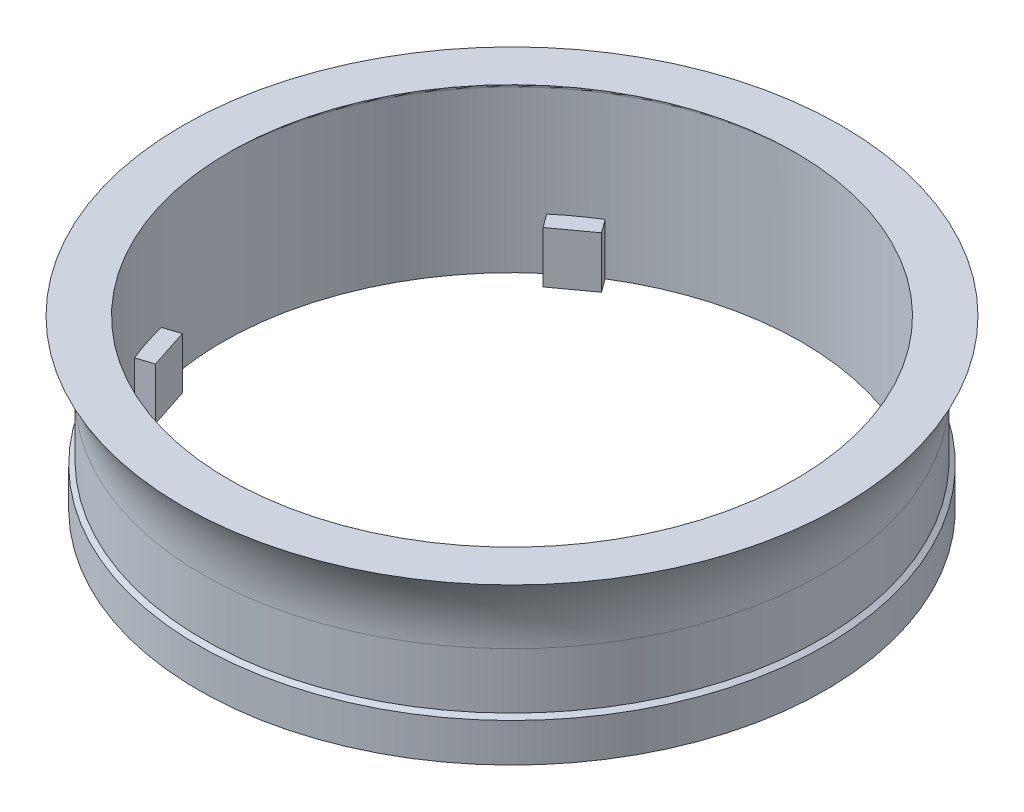
ISO-10303-21;
HEADER;
FILE_DESCRIPTION(('STEP AP214'),'2;1');
FILE_NAME('part.step','',(''),(''),'','','');
FILE_SCHEMA(('AUTOMOTIVE_DESIGN { 1 0 10303 214 1 1 1 1 }'));
ENDSEC;
DATA;
#1=APPLICATION_CONTEXT('core data for automotive mechanical design processes');
#2=APPLICATION_PROTOCOL_DEFINITION('international standard','automotive_design',2000,#1);
#3=PRODUCT_CONTEXT('',#1,'mechanical');
#4=PRODUCT('Part','Part','',(#3));
#5=PRODUCT_RELATED_PRODUCT_CATEGORY('part','',(#4));
#6=PRODUCT_DEFINITION_FORMATION('','',#4);
#7=PRODUCT_DEFINITION_CONTEXT('part definition',#1,'design');
#8=PRODUCT_DEFINITION('design','',#6,#7);
#9=PRODUCT_DEFINITION_SHAPE('','',#8);
#10=(LENGTH_UNIT() NAMED_UNIT(*) SI_UNIT(.MILLI.,.METRE.));
#11=(NAMED_UNIT(*) PLANE_ANGLE_UNIT() SI_UNIT($,.RADIAN.));
#12=(NAMED_UNIT(*) SI_UNIT($,.STERADIAN.) SOLID_ANGLE_UNIT());
#13=UNCERTAINTY_MEASURE_WITH_UNIT(LENGTH_MEASURE(1.E-05),#10,'distance_accuracy_value','');
#14=(GEOMETRIC_REPRESENTATION_CONTEXT(3) GLOBAL_UNCERTAINTY_ASSIGNED_CONTEXT((#13)) GLOBAL_UNIT_ASSIGNED_CONTEXT((#10,
#11,#12)) REPRESENTATION_CONTEXT('',''));
#15=CARTESIAN_POINT('',(0.,0.,0.));
#16=DIRECTION('',(0.,0.,1.));
#17=DIRECTION('',(1.,0.,0.));
#18=AXIS2_PLACEMENT_3D('',#15,#16,#17);
#19=CARTESIAN_POINT('',(0.,13.,0.));
#20=DIRECTION('',(0.,-1.,0.));
#21=DIRECTION('',(0.,0.,-1.));
#22=AXIS2_PLACEMENT_3D('',#19,#20,#21);
#23=PLANE('',#22);
#24=CARTESIAN_POINT('',(0.,13.,0.));
#25=DIRECTION('',(0.,1.,0.));
#26=DIRECTION('',(0.,0.,1.));
#27=AXIS2_PLACEMENT_3D('',#24,#25,#26);
#28=CIRCLE('',#27,25.5955328218123);
#29=CARTESIAN_POINT('',(0.,13.,25.5955328218123));
#30=VERTEX_POINT('',#29);
#31=EDGE_CURVE('E45',#30,#30,#28,.T.);
#32=ORIENTED_EDGE('',*,*,#31,.T.);
#33=EDGE_LOOP('',(#32));
#34=FACE_BOUND('',#33,.T.);
#35=CARTESIAN_POINT('',(0.,13.,0.));
#36=DIRECTION('',(0.,-1.,0.));
#37=DIRECTION('',(0.,0.,-1.));
#38=AXIS2_PLACEMENT_3D('',#35,#36,#37);
#39=CIRCLE('',#38,22.);
#40=CARTESIAN_POINT('',(0.,13.,-22.));
#41=VERTEX_POINT('',#40);
#42=EDGE_CURVE('E218',#41,#41,#39,.T.);
#43=ORIENTED_EDGE('',*,*,#42,.T.);
#44=EDGE_LOOP('',(#43));
#45=FACE_BOUND('',#44,.T.);
#46=ADVANCED_FACE('F42',(#34,#45),#23,.F.);
#47=CARTESIAN_POINT('',(0.,0.,0.));
#48=DIRECTION('',(0.,-1.,0.));
#49=DIRECTION('',(0.,0.,-1.));
#50=AXIS2_PLACEMENT_3D('',#47,#48,#49);
#51=CYLINDRICAL_SURFACE('',#50,24.35);
#52=CARTESIAN_POINT('',(0.,3.,0.));
#53=DIRECTION('',(0.,-1.,0.));
#54=DIRECTION('',(0.,0.,-1.));
#55=AXIS2_PLACEMENT_3D('',#52,#53,#54);
#56=CIRCLE('',#55,24.35);
#57=CARTESIAN_POINT('',(0.,3.,-24.35));
#58=VERTEX_POINT('',#57);
#59=EDGE_CURVE('E244',#58,#58,#56,.T.);
#60=ORIENTED_EDGE('',*,*,#59,.T.);
#61=EDGE_LOOP('',(#60));
#62=FACE_BOUND('',#61,.T.);
#63=CARTESIAN_POINT('',(0.,0.,0.));
#64=DIRECTION('',(0.,-1.,0.));
#65=DIRECTION('',(0.,0.,-1.));
#66=AXIS2_PLACEMENT_3D('',#63,#64,#65);
#67=CIRCLE('',#66,24.35);
#68=CARTESIAN_POINT('',(0.,0.,-24.35));
#69=VERTEX_POINT('',#68);
#70=EDGE_CURVE('E254',#69,#69,#67,.T.);
#71=ORIENTED_EDGE('',*,*,#70,.F.);
#72=EDGE_LOOP('',(#71));
#73=FACE_BOUND('',#72,.T.);
#74=ADVANCED_FACE('F509',(#62,#73),#51,.T.);
#75=CARTESIAN_POINT('',(0.,3.,0.));
#76=DIRECTION('',(0.,-1.,0.));
#77=DIRECTION('',(0.,0.,-1.));
#78=AXIS2_PLACEMENT_3D('',#75,#76,#77);
#79=CONICAL_SURFACE('',#78,24.35,0.950546840812071);
#80=CARTESIAN_POINT('',(0.,3.25,0.));
#81=DIRECTION('',(0.,-1.,0.));
#82=DIRECTION('',(0.,0.,-1.));
#83=AXIS2_PLACEMENT_3D('',#80,#81,#82);
#84=CIRCLE('',#83,24.);
#85=CARTESIAN_POINT('',(0.,3.25,-24.));
#86=VERTEX_POINT('',#85);
#87=EDGE_CURVE('E238',#86,#86,#84,.T.);
#88=ORIENTED_EDGE('',*,*,#87,.T.);
#89=EDGE_LOOP('',(#88));
#90=FACE_BOUND('',#89,.T.);
#91=ORIENTED_EDGE('',*,*,#59,.F.);
#92=EDGE_LOOP('',(#91));
#93=FACE_BOUND('',#92,.T.);
#94=ADVANCED_FACE('F514',(#90,#93),#79,.T.);
#95=CARTESIAN_POINT('',(0.,0.,0.));
#96=DIRECTION('',(0.,-1.,0.));
#97=DIRECTION('',(0.,0.,-1.));
#98=AXIS2_PLACEMENT_3D('',#95,#96,#97);
#99=CYLINDRICAL_SURFACE('',#98,24.);
#100=CARTESIAN_POINT('',(0.,7.58105808752612,0.));
#101=DIRECTION('',(0.,-1.,0.));
#102=DIRECTION('',(0.,0.,-1.));
#103=AXIS2_PLACEMENT_3D('',#100,#101,#102);
#104=CIRCLE('',#103,24.);
#105=CARTESIAN_POINT('',(0.,7.58105808752612,-24.));
#106=VERTEX_POINT('',#105);
#107=EDGE_CURVE('E235',#106,#106,#104,.T.);
#108=ORIENTED_EDGE('',*,*,#107,.T.);
#109=EDGE_LOOP('',(#108));
#110=FACE_BOUND('',#109,.T.);
#111=ORIENTED_EDGE('',*,*,#87,.F.);
#112=EDGE_LOOP('',(#111));
#113=FACE_BOUND('',#112,.T.);
#114=ADVANCED_FACE('F232',(#110,#113),#99,.T.);
#115=CARTESIAN_POINT('',(0.,7.58105808752617,0.));
#116=DIRECTION('',(0.,-1.,0.));
#117=DIRECTION('',(0.,0.,-1.));
#118=AXIS2_PLACEMENT_3D('',#115,#116,#117);
#119=TOROIDAL_SURFACE('',#118,34.,10.);
#120=ORIENTED_EDGE('',*,*,#31,.F.);
#121=EDGE_LOOP('',(#120));
#122=FACE_BOUND('',#121,.T.);
#123=ORIENTED_EDGE('',*,*,#107,.F.);
#124=EDGE_LOOP('',(#123));
#125=FACE_BOUND('',#124,.T.);
#126=ADVANCED_FACE('F228',(#122,#125),#119,.F.);
#127=CARTESIAN_POINT('',(0.,0.,21.15));
#128=DIRECTION('',(0.,0.,-1.));
#129=DIRECTION('',(-1.,0.,0.));
#130=AXIS2_PLACEMENT_3D('',#127,#128,#129);
#131=PLANE('',#130);
#132=DIRECTION('',(0.,1.,0.));
#133=VECTOR('',#132,1.);
#134=CARTESIAN_POINT('',(-1.625,4.,21.15));
#135=LINE('',#134,#133);
#136=CARTESIAN_POINT('',(-1.625,0.,21.15));
#137=VERTEX_POINT('',#136);
#138=CARTESIAN_POINT('',(-1.625,4.,21.15));
#139=VERTEX_POINT('',#138);
#140=EDGE_CURVE('E295',#137,#139,#135,.T.);
#141=ORIENTED_EDGE('',*,*,#140,.T.);
#142=DIRECTION('',(1.,0.,0.));
#143=VECTOR('',#142,1.);
#144=CARTESIAN_POINT('',(1.625,4.,21.15));
#145=LINE('',#144,#143);
#146=CARTESIAN_POINT('',(1.625,4.,21.15));
#147=VERTEX_POINT('',#146);
#148=EDGE_CURVE('E292',#139,#147,#145,.T.);
#149=ORIENTED_EDGE('',*,*,#148,.T.);
#150=DIRECTION('',(0.,-1.,0.));
#151=VECTOR('',#150,1.);
#152=CARTESIAN_POINT('',(1.625,4.,21.15));
#153=LINE('',#152,#151);
#154=CARTESIAN_POINT('',(1.625,0.,21.15));
#155=VERTEX_POINT('',#154);
#156=EDGE_CURVE('E289',#147,#155,#153,.T.);
#157=ORIENTED_EDGE('',*,*,#156,.T.);
#158=DIRECTION('',(-1.,0.,0.));
#159=VECTOR('',#158,1.);
#160=CARTESIAN_POINT('',(1.625,0.,21.15));
#161=LINE('',#160,#159);
#162=EDGE_CURVE('E286',#155,#137,#161,.T.);
#163=ORIENTED_EDGE('',*,*,#162,.T.);
#164=EDGE_LOOP('',(#141,#149,#157,#163));
#165=FACE_BOUND('',#164,.T.);
#166=ADVANCED_FACE('F231',(#165),#131,.T.);
#167=CARTESIAN_POINT('',(-20.1148453196425,0.,6.53570943103008));
#168=DIRECTION('',(0.951056516295155,0.,-0.309016994374945));
#169=DIRECTION('',(-0.309016994374945,0.,-0.951056516295155));
#170=AXIS2_PLACEMENT_3D('',#167,#168,#169);
#171=PLANE('',#170);
#172=DIRECTION('',(0.,1.,0.));
#173=VECTOR('',#172,1.);
#174=CARTESIAN_POINT('',(-20.6169979355018,4.,4.99024259205046));
#175=LINE('',#174,#173);
#176=CARTESIAN_POINT('',(-20.6169979355018,0.,4.99024259205045));
#177=VERTEX_POINT('',#176);
#178=CARTESIAN_POINT('',(-20.6169979355018,4.,4.99024259205046));
#179=VERTEX_POINT('',#178);
#180=EDGE_CURVE('E331',#177,#179,#175,.T.);
#181=ORIENTED_EDGE('',*,*,#180,.T.);
#182=DIRECTION('',(0.309016994374945,0.,0.951056516295155));
#183=VECTOR('',#182,1.);
#184=CARTESIAN_POINT('',(-19.6126927037832,4.,8.08117627000971));
#185=LINE('',#184,#183);
#186=CARTESIAN_POINT('',(-19.6126927037832,4.,8.08117627000971));
#187=VERTEX_POINT('',#186);
#188=EDGE_CURVE('E328',#179,#187,#185,.T.);
#189=ORIENTED_EDGE('',*,*,#188,.T.);
#190=DIRECTION('',(0.,-1.,0.));
#191=VECTOR('',#190,1.);
#192=CARTESIAN_POINT('',(-19.6126927037832,4.,8.08117627000971));
#193=LINE('',#192,#191);
#194=CARTESIAN_POINT('',(-19.6126927037832,0.,8.08117627000971));
#195=VERTEX_POINT('',#194);
#196=EDGE_CURVE('E325',#187,#195,#193,.T.);
#197=ORIENTED_EDGE('',*,*,#196,.T.);
#198=DIRECTION('',(-0.309016994374945,0.,-0.951056516295155));
#199=VECTOR('',#198,1.);
#200=CARTESIAN_POINT('',(-19.6126927037832,0.,8.08117627000971));
#201=LINE('',#200,#199);
#202=EDGE_CURVE('E322',#195,#177,#201,.T.);
#203=ORIENTED_EDGE('',*,*,#202,.T.);
#204=EDGE_LOOP('',(#181,#189,#197,#203));
#205=FACE_BOUND('',#204,.T.);
#206=ADVANCED_FACE('F495',(#205),#171,.T.);
#207=CARTESIAN_POINT('',(-12.4316580859857,0.,-17.1107094310302));
#208=DIRECTION('',(0.587785252292469,0.,0.809016994374951));
#209=DIRECTION('',(0.809016994374951,0.,-0.587785252292469));
#210=AXIS2_PLACEMENT_3D('',#207,#208,#209);
#211=PLANE('',#210);
#212=DIRECTION('',(0.,1.,0.));
#213=VECTOR('',#212,1.);
#214=CARTESIAN_POINT('',(-11.1170054701264,4.,-18.0658604660055));
#215=LINE('',#214,#213);
#216=CARTESIAN_POINT('',(-11.1170054701264,0.,-18.0658604660055));
#217=VERTEX_POINT('',#216);
#218=CARTESIAN_POINT('',(-11.1170054701264,4.,-18.0658604660055));
#219=VERTEX_POINT('',#218);
#220=EDGE_CURVE('E367',#217,#219,#215,.T.);
#221=ORIENTED_EDGE('',*,*,#220,.T.);
#222=DIRECTION('',(-0.809016994374951,0.,0.587785252292469));
#223=VECTOR('',#222,1.);
#224=CARTESIAN_POINT('',(-13.746310701845,4.,-16.1555583960549));
#225=LINE('',#224,#223);
#226=CARTESIAN_POINT('',(-13.746310701845,4.,-16.1555583960549));
#227=VERTEX_POINT('',#226);
#228=EDGE_CURVE('E364',#219,#227,#225,.T.);
#229=ORIENTED_EDGE('',*,*,#228,.T.);
#230=DIRECTION('',(0.,-1.,0.));
#231=VECTOR('',#230,1.);
#232=CARTESIAN_POINT('',(-13.746310701845,4.,-16.1555583960549));
#233=LINE('',#232,#231);
#234=CARTESIAN_POINT('',(-13.746310701845,0.,-16.1555583960549));
#235=VERTEX_POINT('',#234);
#236=EDGE_CURVE('E361',#227,#235,#233,.T.);
#237=ORIENTED_EDGE('',*,*,#236,.T.);
#238=DIRECTION('',(0.809016994374951,0.,-0.587785252292468));
#239=VECTOR('',#238,1.);
#240=CARTESIAN_POINT('',(-13.746310701845,0.,-16.1555583960549));
#241=LINE('',#240,#239);
#242=EDGE_CURVE('E358',#235,#217,#241,.T.);
#243=ORIENTED_EDGE('',*,*,#242,.T.);
#244=EDGE_LOOP('',(#221,#229,#237,#243));
#245=FACE_BOUND('',#244,.T.);
#246=ADVANCED_FACE('F456',(#245),#211,.T.);
#247=CARTESIAN_POINT('',(12.431658085986,0.,-17.11070943103));
#248=DIRECTION('',(-0.58778525229248,0.,0.809016994374942));
#249=DIRECTION('',(0.809016994374942,0.,0.58778525229248));
#250=AXIS2_PLACEMENT_3D('',#247,#248,#249);
#251=PLANE('',#250);
#252=DIRECTION('',(0.,1.,0.));
#253=VECTOR('',#252,1.);
#254=CARTESIAN_POINT('',(13.7463107018452,4.,-16.1555583960547));
#255=LINE('',#254,#253);
#256=CARTESIAN_POINT('',(13.7463107018452,0.,-16.1555583960547));
#257=VERTEX_POINT('',#256);
#258=CARTESIAN_POINT('',(13.7463107018452,4.,-16.1555583960547));
#259=VERTEX_POINT('',#258);
#260=EDGE_CURVE('E403',#257,#259,#255,.T.);
#261=ORIENTED_EDGE('',*,*,#260,.T.);
#262=DIRECTION('',(-0.809016994374942,0.,-0.58778525229248));
#263=VECTOR('',#262,1.);
#264=CARTESIAN_POINT('',(11.1170054701267,4.,-18.0658604660053));
#265=LINE('',#264,#263);
#266=CARTESIAN_POINT('',(11.1170054701267,4.,-18.0658604660053));
#267=VERTEX_POINT('',#266);
#268=EDGE_CURVE('E400',#259,#267,#265,.T.);
#269=ORIENTED_EDGE('',*,*,#268,.T.);
#270=DIRECTION('',(0.,-1.,0.));
#271=VECTOR('',#270,1.);
#272=CARTESIAN_POINT('',(11.1170054701267,4.,-18.0658604660053));
#273=LINE('',#272,#271);
#274=CARTESIAN_POINT('',(11.1170054701267,0.,-18.0658604660053));
#275=VERTEX_POINT('',#274);
#276=EDGE_CURVE('E397',#267,#275,#273,.T.);
#277=ORIENTED_EDGE('',*,*,#276,.T.);
#278=DIRECTION('',(0.809016994374942,0.,0.58778525229248));
#279=VECTOR('',#278,1.);
#280=CARTESIAN_POINT('',(11.1170054701267,0.,-18.0658604660053));
#281=LINE('',#280,#279);
#282=EDGE_CURVE('E394',#275,#257,#281,.T.);
#283=ORIENTED_EDGE('',*,*,#282,.T.);
#284=EDGE_LOOP('',(#261,#269,#277,#283));
#285=FACE_BOUND('',#284,.T.);
#286=ADVANCED_FACE('F432',(#285),#251,.T.);
#287=CARTESIAN_POINT('',(20.1148453196424,0.,6.53570943103037));
#288=DIRECTION('',(-0.95105651629515,0.,-0.309016994374958));
#289=DIRECTION('',(-0.309016994374958,0.,0.95105651629515));
#290=AXIS2_PLACEMENT_3D('',#287,#288,#289);
#291=PLANE('',#290);
#292=DIRECTION('',(0.,1.,0.));
#293=VECTOR('',#292,1.);
#294=CARTESIAN_POINT('',(19.6126927037831,4.,8.08117627000999));
#295=LINE('',#294,#293);
#296=CARTESIAN_POINT('',(19.6126927037831,0.,8.08117627000999));
#297=VERTEX_POINT('',#296);
#298=CARTESIAN_POINT('',(19.6126927037831,4.,8.08117627000999));
#299=VERTEX_POINT('',#298);
#300=EDGE_CURVE('E12',#297,#299,#295,.T.);
#301=ORIENTED_EDGE('',*,*,#300,.T.);
#302=DIRECTION('',(0.309016994374958,0.,-0.95105651629515));
#303=VECTOR('',#302,1.);
#304=CARTESIAN_POINT('',(20.6169979355017,4.,4.99024259205075));
#305=LINE('',#304,#303);
#306=CARTESIAN_POINT('',(20.6169979355017,4.,4.99024259205075));
#307=VERTEX_POINT('',#306);
#308=EDGE_CURVE('E51',#299,#307,#305,.T.);
#309=ORIENTED_EDGE('',*,*,#308,.T.);
#310=DIRECTION('',(0.,-1.,0.));
#311=VECTOR('',#310,1.);
#312=CARTESIAN_POINT('',(20.6169979355017,4.,4.99024259205075));
#313=LINE('',#312,#311);
#314=CARTESIAN_POINT('',(20.6169979355017,0.,4.99024259205075));
#315=VERTEX_POINT('',#314);
#316=EDGE_CURVE('E199',#307,#315,#313,.T.);
#317=ORIENTED_EDGE('',*,*,#316,.T.);
#318=DIRECTION('',(-0.309016994374958,0.,0.95105651629515));
#319=VECTOR('',#318,1.);
#320=CARTESIAN_POINT('',(20.6169979355017,0.,4.99024259205075));
#321=LINE('',#320,#319);
#322=EDGE_CURVE('E212',#315,#297,#321,.T.);
#323=ORIENTED_EDGE('',*,*,#322,.T.);
#324=EDGE_LOOP('',(#301,#309,#317,#323));
#325=FACE_BOUND('',#324,.T.);
#326=ADVANCED_FACE('F421',(#325),#291,.T.);
#327=CARTESIAN_POINT('',(13.7463107018452,4.,-16.1555583960547));
#328=DIRECTION('',(-0.809016994374942,0.,-0.58778525229248));
#329=DIRECTION('',(-0.58778525229248,0.,0.809016994374942));
#330=AXIS2_PLACEMENT_3D('',#327,#328,#329);
#331=PLANE('',#330);
#332=DIRECTION('',(0.,-1.,0.));
#333=VECTOR('',#332,1.);
#334=CARTESIAN_POINT('',(14.5052841321754,0.,-17.2001957036791));
#335=LINE('',#334,#333);
#336=CARTESIAN_POINT('',(14.5052841321754,4.,-17.2001957036791));
#337=VERTEX_POINT('',#336);
#338=CARTESIAN_POINT('',(14.5052841321754,0.,-17.2001957036791));
#339=VERTEX_POINT('',#338);
#340=EDGE_CURVE('E371',#337,#339,#335,.T.);
#341=ORIENTED_EDGE('',*,*,#340,.F.);
#342=DIRECTION('',(0.58778525229248,0.,-0.809016994374942));
#343=VECTOR('',#342,1.);
#344=CARTESIAN_POINT('',(13.7463107018452,4.,-16.1555583960547));
#345=LINE('',#344,#343);
#346=EDGE_CURVE('E378',#259,#337,#345,.T.);
#347=ORIENTED_EDGE('',*,*,#346,.F.);
#348=ORIENTED_EDGE('',*,*,#260,.F.);
#349=DIRECTION('',(0.58778525229248,0.,-0.809016994374942));
#350=VECTOR('',#349,1.);
#351=CARTESIAN_POINT('',(13.7463107018452,0.,-16.1555583960547));
#352=LINE('',#351,#350);
#353=EDGE_CURVE('E390',#257,#339,#352,.T.);
#354=ORIENTED_EDGE('',*,*,#353,.T.);
#355=EDGE_LOOP('',(#341,#347,#348,#354));
#356=FACE_BOUND('',#355,.T.);
#357=ADVANCED_FACE('F429',(#356),#331,.F.);
#358=CARTESIAN_POINT('',(11.1170054701267,4.,-18.0658604660053));
#359=DIRECTION('',(0.,-1.,0.));
#360=DIRECTION('',(0.,0.,-1.));
#361=AXIS2_PLACEMENT_3D('',#358,#359,#360);
#362=PLANE('',#361);
#363=CARTESIAN_POINT('',(0.,4.,0.));
#364=DIRECTION('',(0.,-1.,0.));
#365=DIRECTION('',(0.,0.,-1.));
#366=AXIS2_PLACEMENT_3D('',#363,#364,#365);
#367=CIRCLE('',#366,22.5);
#368=CARTESIAN_POINT('',(11.8759789004568,4.,-19.1104977736297));
#369=VERTEX_POINT('',#368);
#370=EDGE_CURVE('E185',#369,#337,#367,.T.);
#371=ORIENTED_EDGE('',*,*,#370,.F.);
#372=DIRECTION('',(0.58778525229248,0.,-0.809016994374942));
#373=VECTOR('',#372,1.);
#374=CARTESIAN_POINT('',(11.1170054701267,4.,-18.0658604660053));
#375=LINE('',#374,#373);
#376=EDGE_CURVE('E382',#267,#369,#375,.T.);
#377=ORIENTED_EDGE('',*,*,#376,.F.);
#378=ORIENTED_EDGE('',*,*,#268,.F.);
#379=ORIENTED_EDGE('',*,*,#346,.T.);
#380=EDGE_LOOP('',(#371,#377,#378,#379));
#381=FACE_BOUND('',#380,.T.);
#382=ADVANCED_FACE('F591',(#381),#362,.F.);
#383=CARTESIAN_POINT('',(11.1170054701267,4.,-18.0658604660053));
#384=DIRECTION('',(0.809016994374942,0.,0.58778525229248));
#385=DIRECTION('',(0.58778525229248,0.,-0.809016994374942));
#386=AXIS2_PLACEMENT_3D('',#383,#384,#385);
#387=PLANE('',#386);
#388=DIRECTION('',(0.,-1.,0.));
#389=VECTOR('',#388,1.);
#390=CARTESIAN_POINT('',(11.8759789004568,0.,-19.1104977736297));
#391=LINE('',#390,#389);
#392=CARTESIAN_POINT('',(11.8759789004568,0.,-19.1104977736297));
#393=VERTEX_POINT('',#392);
#394=EDGE_CURVE('E374',#393,#369,#391,.F.);
#395=ORIENTED_EDGE('',*,*,#394,.F.);
#396=DIRECTION('',(0.58778525229248,0.,-0.809016994374942));
#397=VECTOR('',#396,1.);
#398=CARTESIAN_POINT('',(11.1170054701267,0.,-18.0658604660053));
#399=LINE('',#398,#397);
#400=EDGE_CURVE('E386',#275,#393,#399,.T.);
#401=ORIENTED_EDGE('',*,*,#400,.F.);
#402=ORIENTED_EDGE('',*,*,#276,.F.);
#403=ORIENTED_EDGE('',*,*,#376,.T.);
#404=EDGE_LOOP('',(#395,#401,#402,#403));
#405=FACE_BOUND('',#404,.T.);
#406=ADVANCED_FACE('F440',(#405),#387,.F.);
#407=CARTESIAN_POINT('',(-11.1170054701264,4.,-18.0658604660055));
#408=DIRECTION('',(-0.809016994374951,0.,0.587785252292469));
#409=DIRECTION('',(0.587785252292469,0.,0.809016994374951));
#410=AXIS2_PLACEMENT_3D('',#407,#408,#409);
#411=PLANE('',#410);
#412=DIRECTION('',(0.,-1.,0.));
#413=VECTOR('',#412,1.);
#414=CARTESIAN_POINT('',(-11.8759789004565,0.,-19.1104977736298));
#415=LINE('',#414,#413);
#416=CARTESIAN_POINT('',(-11.8759789004565,4.,-19.1104977736298));
#417=VERTEX_POINT('',#416);
#418=CARTESIAN_POINT('',(-11.8759789004565,0.,-19.1104977736298));
#419=VERTEX_POINT('',#418);
#420=EDGE_CURVE('E335',#417,#419,#415,.T.);
#421=ORIENTED_EDGE('',*,*,#420,.F.);
#422=DIRECTION('',(-0.587785252292469,0.,-0.809016994374951));
#423=VECTOR('',#422,1.);
#424=CARTESIAN_POINT('',(-11.1170054701264,4.,-18.0658604660055));
#425=LINE('',#424,#423);
#426=EDGE_CURVE('E342',#219,#417,#425,.T.);
#427=ORIENTED_EDGE('',*,*,#426,.F.);
#428=ORIENTED_EDGE('',*,*,#220,.F.);
#429=DIRECTION('',(-0.587785252292469,0.,-0.809016994374951));
#430=VECTOR('',#429,1.);
#431=CARTESIAN_POINT('',(-11.1170054701264,0.,-18.0658604660055));
#432=LINE('',#431,#430);
#433=EDGE_CURVE('E354',#217,#419,#432,.T.);
#434=ORIENTED_EDGE('',*,*,#433,.T.);
#435=EDGE_LOOP('',(#421,#427,#428,#434));
#436=FACE_BOUND('',#435,.T.);
#437=ADVANCED_FACE('F573',(#436),#411,.F.);
#438=CARTESIAN_POINT('',(-13.746310701845,4.,-16.1555583960549));
#439=DIRECTION('',(0.,-1.,0.));
#440=DIRECTION('',(0.,0.,-1.));
#441=AXIS2_PLACEMENT_3D('',#438,#439,#440);
#442=PLANE('',#441);
#443=CARTESIAN_POINT('',(0.,4.,0.));
#444=DIRECTION('',(0.,-1.,0.));
#445=DIRECTION('',(0.,0.,-1.));
#446=AXIS2_PLACEMENT_3D('',#443,#444,#445);
#447=CIRCLE('',#446,22.5);
#448=CARTESIAN_POINT('',(-14.5052841321751,4.,-17.2001957036793));
#449=VERTEX_POINT('',#448);
#450=EDGE_CURVE('E460',#449,#417,#447,.T.);
#451=ORIENTED_EDGE('',*,*,#450,.F.);
#452=DIRECTION('',(-0.587785252292469,0.,-0.809016994374951));
#453=VECTOR('',#452,1.);
#454=CARTESIAN_POINT('',(-13.746310701845,4.,-16.1555583960549));
#455=LINE('',#454,#453);
#456=EDGE_CURVE('E346',#227,#449,#455,.T.);
#457=ORIENTED_EDGE('',*,*,#456,.F.);
#458=ORIENTED_EDGE('',*,*,#228,.F.);
#459=ORIENTED_EDGE('',*,*,#426,.T.);
#460=EDGE_LOOP('',(#451,#457,#458,#459));
#461=FACE_BOUND('',#460,.T.);
#462=ADVANCED_FACE('F459',(#461),#442,.F.);
#463=CARTESIAN_POINT('',(-13.746310701845,4.,-16.1555583960549));
#464=DIRECTION('',(0.809016994374951,0.,-0.587785252292469));
#465=DIRECTION('',(-0.587785252292469,0.,-0.809016994374951));
#466=AXIS2_PLACEMENT_3D('',#463,#464,#465);
#467=PLANE('',#466);
#468=DIRECTION('',(0.,-1.,0.));
#469=VECTOR('',#468,1.);
#470=CARTESIAN_POINT('',(-14.5052841321751,0.,-17.2001957036793));
#471=LINE('',#470,#469);
#472=CARTESIAN_POINT('',(-14.5052841321751,0.,-17.2001957036793));
#473=VERTEX_POINT('',#472);
#474=EDGE_CURVE('E338',#473,#449,#471,.F.);
#475=ORIENTED_EDGE('',*,*,#474,.F.);
#476=DIRECTION('',(-0.587785252292469,0.,-0.809016994374951));
#477=VECTOR('',#476,1.);
#478=CARTESIAN_POINT('',(-13.746310701845,0.,-16.1555583960549));
#479=LINE('',#478,#477);
#480=EDGE_CURVE('E350',#235,#473,#479,.T.);
#481=ORIENTED_EDGE('',*,*,#480,.F.);
#482=ORIENTED_EDGE('',*,*,#236,.F.);
#483=ORIENTED_EDGE('',*,*,#456,.T.);
#484=EDGE_LOOP('',(#475,#481,#482,#483));
#485=FACE_BOUND('',#484,.T.);
#486=ADVANCED_FACE('F450',(#485),#467,.F.);
#487=CARTESIAN_POINT('',(-20.6169979355018,4.,4.99024259205046));
#488=DIRECTION('',(0.309016994374945,0.,0.951056516295154));
#489=DIRECTION('',(0.951056516295155,0.,-0.309016994374945));
#490=AXIS2_PLACEMENT_3D('',#487,#488,#489);
#491=PLANE('',#490);
#492=DIRECTION('',(0.,-1.,0.));
#493=VECTOR('',#492,1.);
#494=CARTESIAN_POINT('',(-21.845042742334,0.,5.38925853764678));
#495=LINE('',#494,#493);
#496=CARTESIAN_POINT('',(-21.845042742334,4.,5.38925853764678));
#497=VERTEX_POINT('',#496);
#498=CARTESIAN_POINT('',(-21.845042742334,0.,5.38925853764678));
#499=VERTEX_POINT('',#498);
#500=EDGE_CURVE('E299',#497,#499,#495,.T.);
#501=ORIENTED_EDGE('',*,*,#500,.F.);
#502=DIRECTION('',(-0.951056516295154,0.,0.309016994374945));
#503=VECTOR('',#502,1.);
#504=CARTESIAN_POINT('',(-20.6169979355018,4.,4.99024259205046));
#505=LINE('',#504,#503);
#506=EDGE_CURVE('E306',#179,#497,#505,.T.);
#507=ORIENTED_EDGE('',*,*,#506,.F.);
#508=ORIENTED_EDGE('',*,*,#180,.F.);
#509=DIRECTION('',(-0.951056516295154,0.,0.309016994374945));
#510=VECTOR('',#509,1.);
#511=CARTESIAN_POINT('',(-20.6169979355018,0.,4.99024259205045));
#512=LINE('',#511,#510);
#513=EDGE_CURVE('E318',#177,#499,#512,.T.);
#514=ORIENTED_EDGE('',*,*,#513,.T.);
#515=EDGE_LOOP('',(#501,#507,#508,#514));
#516=FACE_BOUND('',#515,.T.);
#517=ADVANCED_FACE('F492',(#516),#491,.F.);
#518=CARTESIAN_POINT('',(-19.6126927037832,4.,8.08117627000971));
#519=DIRECTION('',(0.,-1.,0.));
#520=DIRECTION('',(0.,0.,-1.));
#521=AXIS2_PLACEMENT_3D('',#518,#519,#520);
#522=PLANE('',#521);
#523=CARTESIAN_POINT('',(0.,4.,0.));
#524=DIRECTION('',(0.,-1.,0.));
#525=DIRECTION('',(0.,0.,-1.));
#526=AXIS2_PLACEMENT_3D('',#523,#524,#525);
#527=CIRCLE('',#526,22.5);
#528=CARTESIAN_POINT('',(-20.8407375106155,4.,8.48019221560603));
#529=VERTEX_POINT('',#528);
#530=EDGE_CURVE('E462',#529,#497,#527,.T.);
#531=ORIENTED_EDGE('',*,*,#530,.F.);
#532=DIRECTION('',(-0.951056516295154,0.,0.309016994374945));
#533=VECTOR('',#532,1.);
#534=CARTESIAN_POINT('',(-19.6126927037832,4.,8.08117627000971));
#535=LINE('',#534,#533);
#536=EDGE_CURVE('E310',#187,#529,#535,.T.);
#537=ORIENTED_EDGE('',*,*,#536,.F.);
#538=ORIENTED_EDGE('',*,*,#188,.F.);
#539=ORIENTED_EDGE('',*,*,#506,.T.);
#540=EDGE_LOOP('',(#531,#537,#538,#539));
#541=FACE_BOUND('',#540,.T.);
#542=ADVANCED_FACE('F489',(#541),#522,.F.);
#543=CARTESIAN_POINT('',(-19.6126927037832,4.,8.08117627000971));
#544=DIRECTION('',(-0.309016994374945,0.,-0.951056516295154));
#545=DIRECTION('',(-0.951056516295155,0.,0.309016994374945));
#546=AXIS2_PLACEMENT_3D('',#543,#544,#545);
#547=PLANE('',#546);
#548=DIRECTION('',(0.,-1.,0.));
#549=VECTOR('',#548,1.);
#550=CARTESIAN_POINT('',(-20.8407375106155,0.,8.48019221560603));
#551=LINE('',#550,#549);
#552=CARTESIAN_POINT('',(-20.8407375106155,0.,8.48019221560603));
#553=VERTEX_POINT('',#552);
#554=EDGE_CURVE('E302',#553,#529,#551,.F.);
#555=ORIENTED_EDGE('',*,*,#554,.F.);
#556=DIRECTION('',(-0.951056516295154,0.,0.309016994374945));
#557=VECTOR('',#556,1.);
#558=CARTESIAN_POINT('',(-19.6126927037832,0.,8.08117627000971));
#559=LINE('',#558,#557);
#560=EDGE_CURVE('E314',#195,#553,#559,.T.);
#561=ORIENTED_EDGE('',*,*,#560,.F.);
#562=ORIENTED_EDGE('',*,*,#196,.F.);
#563=ORIENTED_EDGE('',*,*,#536,.T.);
#564=EDGE_LOOP('',(#555,#561,#562,#563));
#565=FACE_BOUND('',#564,.T.);
#566=ADVANCED_FACE('F485',(#565),#547,.F.);
#567=CARTESIAN_POINT('',(-1.625,4.,21.15));
#568=DIRECTION('',(1.,0.,0.));
#569=DIRECTION('',(0.,1.,0.));
#570=AXIS2_PLACEMENT_3D('',#567,#568,#569);
#571=PLANE('',#570);
#572=DIRECTION('',(0.,-1.,0.));
#573=VECTOR('',#572,1.);
#574=CARTESIAN_POINT('',(-1.625,0.,22.4412427240561));
#575=LINE('',#574,#573);
#576=CARTESIAN_POINT('',(-1.625,4.,22.4412427240561));
#577=VERTEX_POINT('',#576);
#578=CARTESIAN_POINT('',(-1.625,0.,22.4412427240561));
#579=VERTEX_POINT('',#578);
#580=EDGE_CURVE('E263',#577,#579,#575,.T.);
#581=ORIENTED_EDGE('',*,*,#580,.F.);
#582=DIRECTION('',(0.,0.,1.));
#583=VECTOR('',#582,1.);
#584=CARTESIAN_POINT('',(-1.625,4.,21.15));
#585=LINE('',#584,#583);
#586=EDGE_CURVE('E270',#139,#577,#585,.T.);
#587=ORIENTED_EDGE('',*,*,#586,.F.);
#588=ORIENTED_EDGE('',*,*,#140,.F.);
#589=DIRECTION('',(0.,0.,1.));
#590=VECTOR('',#589,1.);
#591=CARTESIAN_POINT('',(-1.625,0.,21.15));
#592=LINE('',#591,#590);
#593=EDGE_CURVE('E282',#137,#579,#592,.T.);
#594=ORIENTED_EDGE('',*,*,#593,.T.);
#595=EDGE_LOOP('',(#581,#587,#588,#594));
#596=FACE_BOUND('',#595,.T.);
#597=ADVANCED_FACE('F475',(#596),#571,.F.);
#598=CARTESIAN_POINT('',(1.625,4.,21.15));
#599=DIRECTION('',(0.,-1.,0.));
#600=DIRECTION('',(0.,0.,-1.));
#601=AXIS2_PLACEMENT_3D('',#598,#599,#600);
#602=PLANE('',#601);
#603=CARTESIAN_POINT('',(0.,4.,0.));
#604=DIRECTION('',(0.,-1.,0.));
#605=DIRECTION('',(0.,0.,-1.));
#606=AXIS2_PLACEMENT_3D('',#603,#604,#605);
#607=CIRCLE('',#606,22.5);
#608=CARTESIAN_POINT('',(1.625,4.,22.4412427240561));
#609=VERTEX_POINT('',#608);
#610=EDGE_CURVE('E247',#609,#577,#607,.T.);
#611=ORIENTED_EDGE('',*,*,#610,.F.);
#612=DIRECTION('',(0.,0.,1.));
#613=VECTOR('',#612,1.);
#614=CARTESIAN_POINT('',(1.625,4.,21.15));
#615=LINE('',#614,#613);
#616=EDGE_CURVE('E274',#147,#609,#615,.T.);
#617=ORIENTED_EDGE('',*,*,#616,.F.);
#618=ORIENTED_EDGE('',*,*,#148,.F.);
#619=ORIENTED_EDGE('',*,*,#586,.T.);
#620=EDGE_LOOP('',(#611,#617,#618,#619));
#621=FACE_BOUND('',#620,.T.);
#622=ADVANCED_FACE('F478',(#621),#602,.F.);
#623=CARTESIAN_POINT('',(1.625,4.,21.15));
#624=DIRECTION('',(-1.,0.,0.));
#625=DIRECTION('',(0.,-1.,0.));
#626=AXIS2_PLACEMENT_3D('',#623,#624,#625);
#627=PLANE('',#626);
#628=DIRECTION('',(0.,-1.,0.));
#629=VECTOR('',#628,1.);
#630=CARTESIAN_POINT('',(1.625,0.,22.4412427240561));
#631=LINE('',#630,#629);
#632=CARTESIAN_POINT('',(1.625,0.,22.4412427240561));
#633=VERTEX_POINT('',#632);
#634=EDGE_CURVE('E266',#633,#609,#631,.F.);
#635=ORIENTED_EDGE('',*,*,#634,.F.);
#636=DIRECTION('',(0.,0.,1.));
#637=VECTOR('',#636,1.);
#638=CARTESIAN_POINT('',(1.625,0.,21.15));
#639=LINE('',#638,#637);
#640=EDGE_CURVE('E278',#155,#633,#639,.T.);
#641=ORIENTED_EDGE('',*,*,#640,.F.);
#642=ORIENTED_EDGE('',*,*,#156,.F.);
#643=ORIENTED_EDGE('',*,*,#616,.T.);
#644=EDGE_LOOP('',(#635,#641,#642,#643));
#645=FACE_BOUND('',#644,.T.);
#646=ADVANCED_FACE('F527',(#645),#627,.F.);
#647=CARTESIAN_POINT('',(22.5,0.,0.));
#648=DIRECTION('',(0.,-1.,0.));
#649=DIRECTION('',(0.,0.,-1.));
#650=AXIS2_PLACEMENT_3D('',#647,#648,#649);
#651=PLANE('',#650);
#652=CARTESIAN_POINT('',(0.,0.,0.));
#653=DIRECTION('',(0.,-1.,0.));
#654=DIRECTION('',(0.,0.,-1.));
#655=AXIS2_PLACEMENT_3D('',#652,#653,#654);
#656=CIRCLE('',#655,22.5);
#657=CARTESIAN_POINT('',(20.8407375106154,0.,8.48019221560633));
#658=VERTEX_POINT('',#657);
#659=EDGE_CURVE('E262',#658,#633,#656,.T.);
#660=ORIENTED_EDGE('',*,*,#659,.F.);
#661=DIRECTION('',(0.95105651629515,0.,0.309016994374958));
#662=VECTOR('',#661,1.);
#663=CARTESIAN_POINT('',(19.6126927037831,0.,8.08117627000999));
#664=LINE('',#663,#662);
#665=EDGE_CURVE('E205',#297,#658,#664,.T.);
#666=ORIENTED_EDGE('',*,*,#665,.F.);
#667=ORIENTED_EDGE('',*,*,#322,.F.);
#668=DIRECTION('',(0.95105651629515,0.,0.309016994374958));
#669=VECTOR('',#668,1.);
#670=CARTESIAN_POINT('',(20.6169979355017,0.,4.99024259205075));
#671=LINE('',#670,#669);
#672=CARTESIAN_POINT('',(21.845042742334,0.,5.38925853764709));
#673=VERTEX_POINT('',#672);
#674=EDGE_CURVE('E201',#315,#673,#671,.T.);
#675=ORIENTED_EDGE('',*,*,#674,.T.);
#676=EDGE_CURVE('E191',#339,#673,#656,.T.);
#677=ORIENTED_EDGE('',*,*,#676,.F.);
#678=ORIENTED_EDGE('',*,*,#353,.F.);
#679=ORIENTED_EDGE('',*,*,#282,.F.);
#680=ORIENTED_EDGE('',*,*,#400,.T.);
#681=EDGE_CURVE('E426',#419,#393,#656,.T.);
#682=ORIENTED_EDGE('',*,*,#681,.F.);
#683=ORIENTED_EDGE('',*,*,#433,.F.);
#684=ORIENTED_EDGE('',*,*,#242,.F.);
#685=ORIENTED_EDGE('',*,*,#480,.T.);
#686=EDGE_CURVE('E261',#499,#473,#656,.T.);
#687=ORIENTED_EDGE('',*,*,#686,.F.);
#688=ORIENTED_EDGE('',*,*,#513,.F.);
#689=ORIENTED_EDGE('',*,*,#202,.F.);
#690=ORIENTED_EDGE('',*,*,#560,.T.);
#691=EDGE_CURVE('E258',#579,#553,#656,.T.);
#692=ORIENTED_EDGE('',*,*,#691,.F.);
#693=ORIENTED_EDGE('',*,*,#593,.F.);
#694=ORIENTED_EDGE('',*,*,#162,.F.);
#695=ORIENTED_EDGE('',*,*,#640,.T.);
#696=EDGE_LOOP('',(#660,#666,#667,#675,#677,#678,#679,#680,#682,#683,#684,#685,#687,#688,#689,
#690,#692,#693,#694,#695));
#697=FACE_BOUND('',#696,.T.);
#698=ORIENTED_EDGE('',*,*,#70,.T.);
#699=EDGE_LOOP('',(#698));
#700=FACE_BOUND('',#699,.T.);
#701=ADVANCED_FACE('F413',(#697,#700),#651,.T.);
#702=CARTESIAN_POINT('',(19.6126927037831,4.,8.08117627000999));
#703=DIRECTION('',(0.309016994374958,0.,-0.95105651629515));
#704=DIRECTION('',(-0.95105651629515,0.,-0.309016994374958));
#705=AXIS2_PLACEMENT_3D('',#702,#703,#704);
#706=PLANE('',#705);
#707=DIRECTION('',(0.,-1.,0.));
#708=VECTOR('',#707,1.);
#709=CARTESIAN_POINT('',(20.8407375106154,0.,8.48019221560633));
#710=LINE('',#709,#708);
#711=CARTESIAN_POINT('',(20.8407375106154,4.,8.48019221560633));
#712=VERTEX_POINT('',#711);
#713=EDGE_CURVE('E196',#712,#658,#710,.T.);
#714=ORIENTED_EDGE('',*,*,#713,.F.);
#715=DIRECTION('',(0.95105651629515,0.,0.309016994374958));
#716=VECTOR('',#715,1.);
#717=CARTESIAN_POINT('',(19.6126927037831,4.,8.08117627000999));
#718=LINE('',#717,#716);
#719=EDGE_CURVE('E181',#299,#712,#718,.T.);
#720=ORIENTED_EDGE('',*,*,#719,.F.);
#721=ORIENTED_EDGE('',*,*,#300,.F.);
#722=ORIENTED_EDGE('',*,*,#665,.T.);
#723=EDGE_LOOP('',(#714,#720,#721,#722));
#724=FACE_BOUND('',#723,.T.);
#725=ADVANCED_FACE('F420',(#724),#706,.F.);
#726=CARTESIAN_POINT('',(20.6169979355017,4.,4.99024259205075));
#727=DIRECTION('',(0.,-1.,0.));
#728=DIRECTION('',(0.,0.,-1.));
#729=AXIS2_PLACEMENT_3D('',#726,#727,#728);
#730=PLANE('',#729);
#731=CARTESIAN_POINT('',(0.,4.,0.));
#732=DIRECTION('',(0.,-1.,0.));
#733=DIRECTION('',(0.,0.,-1.));
#734=AXIS2_PLACEMENT_3D('',#731,#732,#733);
#735=CIRCLE('',#734,22.5);
#736=CARTESIAN_POINT('',(21.845042742334,4.,5.38925853764709));
#737=VERTEX_POINT('',#736);
#738=EDGE_CURVE('E174',#737,#712,#735,.T.);
#739=ORIENTED_EDGE('',*,*,#738,.F.);
#740=DIRECTION('',(0.95105651629515,0.,0.309016994374958));
#741=VECTOR('',#740,1.);
#742=CARTESIAN_POINT('',(20.6169979355017,4.,4.99024259205075));
#743=LINE('',#742,#741);
#744=EDGE_CURVE('E178',#307,#737,#743,.T.);
#745=ORIENTED_EDGE('',*,*,#744,.F.);
#746=ORIENTED_EDGE('',*,*,#308,.F.);
#747=ORIENTED_EDGE('',*,*,#719,.T.);
#748=EDGE_LOOP('',(#739,#745,#746,#747));
#749=FACE_BOUND('',#748,.T.);
#750=ADVANCED_FACE('F176',(#749),#730,.F.);
#751=CARTESIAN_POINT('',(20.6169979355017,4.,4.99024259205075));
#752=DIRECTION('',(-0.309016994374958,0.,0.95105651629515));
#753=DIRECTION('',(0.95105651629515,0.,0.309016994374958));
#754=AXIS2_PLACEMENT_3D('',#751,#752,#753);
#755=PLANE('',#754);
#756=DIRECTION('',(0.,-1.,0.));
#757=VECTOR('',#756,1.);
#758=CARTESIAN_POINT('',(21.845042742334,0.,5.38925853764709));
#759=LINE('',#758,#757);
#760=EDGE_CURVE('E188',#673,#737,#759,.F.);
#761=ORIENTED_EDGE('',*,*,#760,.F.);
#762=ORIENTED_EDGE('',*,*,#674,.F.);
#763=ORIENTED_EDGE('',*,*,#316,.F.);
#764=ORIENTED_EDGE('',*,*,#744,.T.);
#765=EDGE_LOOP('',(#761,#762,#763,#764));
#766=FACE_BOUND('',#765,.T.);
#767=ADVANCED_FACE('F198',(#766),#755,.F.);
#768=CARTESIAN_POINT('',(0.,0.,0.));
#769=DIRECTION('',(0.,-1.,0.));
#770=DIRECTION('',(0.,0.,-1.));
#771=AXIS2_PLACEMENT_3D('',#768,#769,#770);
#772=CYLINDRICAL_SURFACE('',#771,22.5);
#773=CARTESIAN_POINT('',(0.,12.5,0.));
#774=DIRECTION('',(0.,-1.,0.));
#775=DIRECTION('',(0.,0.,-1.));
#776=AXIS2_PLACEMENT_3D('',#773,#774,#775);
#777=CIRCLE('',#776,22.5);
#778=CARTESIAN_POINT('',(0.,12.5,-22.5));
#779=VERTEX_POINT('',#778);
#780=EDGE_CURVE('E239',#779,#779,#777,.T.);
#781=ORIENTED_EDGE('',*,*,#780,.F.);
#782=EDGE_LOOP('',(#781));
#783=FACE_BOUND('',#782,.T.);
#784=ORIENTED_EDGE('',*,*,#760,.T.);
#785=ORIENTED_EDGE('',*,*,#738,.T.);
#786=ORIENTED_EDGE('',*,*,#713,.T.);
#787=ORIENTED_EDGE('',*,*,#659,.T.);
#788=ORIENTED_EDGE('',*,*,#634,.T.);
#789=ORIENTED_EDGE('',*,*,#610,.T.);
#790=ORIENTED_EDGE('',*,*,#580,.T.);
#791=ORIENTED_EDGE('',*,*,#691,.T.);
#792=ORIENTED_EDGE('',*,*,#554,.T.);
#793=ORIENTED_EDGE('',*,*,#530,.T.);
#794=ORIENTED_EDGE('',*,*,#500,.T.);
#795=ORIENTED_EDGE('',*,*,#686,.T.);
#796=ORIENTED_EDGE('',*,*,#474,.T.);
#797=ORIENTED_EDGE('',*,*,#450,.T.);
#798=ORIENTED_EDGE('',*,*,#420,.T.);
#799=ORIENTED_EDGE('',*,*,#681,.T.);
#800=ORIENTED_EDGE('',*,*,#394,.T.);
#801=ORIENTED_EDGE('',*,*,#370,.T.);
#802=ORIENTED_EDGE('',*,*,#340,.T.);
#803=ORIENTED_EDGE('',*,*,#676,.T.);
#804=EDGE_LOOP('',(#784,#785,#786,#787,#788,#789,#790,#791,#792,#793,#794,#795,#796,#797,#798,
#799,#800,#801,#802,#803));
#805=FACE_BOUND('',#804,.T.);
#806=ADVANCED_FACE('F189',(#783,#805),#772,.F.);
#807=CARTESIAN_POINT('',(0.,12.5,0.));
#808=DIRECTION('',(0.,-1.,0.));
#809=DIRECTION('',(0.,0.,-1.));
#810=AXIS2_PLACEMENT_3D('',#807,#808,#809);
#811=TOROIDAL_SURFACE('',#810,22.,0.5);
#812=ORIENTED_EDGE('',*,*,#780,.T.);
#813=EDGE_LOOP('',(#812));
#814=FACE_BOUND('',#813,.T.);
#815=ORIENTED_EDGE('',*,*,#42,.F.);
#816=EDGE_LOOP('',(#815));
#817=FACE_BOUND('',#816,.T.);
#818=ADVANCED_FACE('F754',(#814,#817),#811,.F.);
#819=CLOSED_SHELL('',(#46,#74,#94,#114,#126,#166,#206,#246,#286,#326,#357,#382,#406,#437,#462,
#486,#517,#542,#566,#597,#622,#646,#701,#725,#750,#767,#806,#818));
#820=MANIFOLD_SOLID_BREP('B2',#819);
#821=ADVANCED_BREP_SHAPE_REPRESENTATION('',(#18,#820),#14);
#822=SHAPE_DEFINITION_REPRESENTATION(#9,#821);
ENDSEC;
END-ISO-10303-21;
